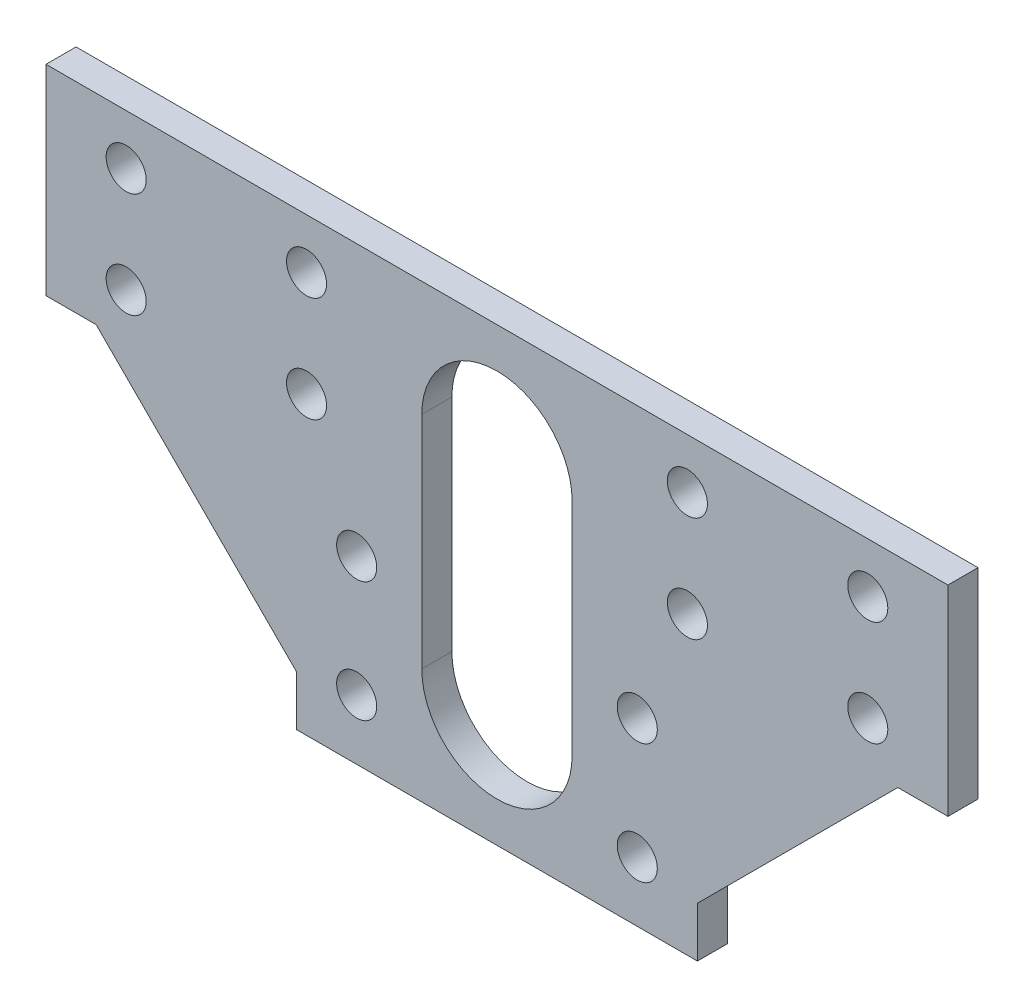
ISO-10303-21;
HEADER;
FILE_DESCRIPTION(('STEP AP214'),'2;1');
FILE_NAME('part.step','',(''),(''),'','','');
FILE_SCHEMA(('AUTOMOTIVE_DESIGN { 1 0 10303 214 1 1 1 1 }'));
ENDSEC;
DATA;
#1=APPLICATION_CONTEXT('core data for automotive mechanical design processes');
#2=APPLICATION_PROTOCOL_DEFINITION('international standard','automotive_design',2000,#1);
#3=PRODUCT_CONTEXT('',#1,'mechanical');
#4=PRODUCT('Part','Part','',(#3));
#5=PRODUCT_RELATED_PRODUCT_CATEGORY('part','',(#4));
#6=PRODUCT_DEFINITION_FORMATION('','',#4);
#7=PRODUCT_DEFINITION_CONTEXT('part definition',#1,'design');
#8=PRODUCT_DEFINITION('design','',#6,#7);
#9=PRODUCT_DEFINITION_SHAPE('','',#8);
#10=(LENGTH_UNIT() NAMED_UNIT(*) SI_UNIT(.MILLI.,.METRE.));
#11=(NAMED_UNIT(*) PLANE_ANGLE_UNIT() SI_UNIT($,.RADIAN.));
#12=(NAMED_UNIT(*) SI_UNIT($,.STERADIAN.) SOLID_ANGLE_UNIT());
#13=UNCERTAINTY_MEASURE_WITH_UNIT(LENGTH_MEASURE(1.E-05),#10,'distance_accuracy_value','');
#14=(GEOMETRIC_REPRESENTATION_CONTEXT(3) GLOBAL_UNCERTAINTY_ASSIGNED_CONTEXT((#13)) GLOBAL_UNIT_ASSIGNED_CONTEXT((#10,
#11,#12)) REPRESENTATION_CONTEXT('',''));
#15=CARTESIAN_POINT('',(0.,0.,0.));
#16=DIRECTION('',(0.,0.,1.));
#17=DIRECTION('',(1.,0.,0.));
#18=AXIS2_PLACEMENT_3D('',#15,#16,#17);
#19=CARTESIAN_POINT('',(0.,-20.,3.));
#20=DIRECTION('',(1.,0.,0.));
#21=DIRECTION('',(0.,0.,-1.));
#22=AXIS2_PLACEMENT_3D('',#19,#20,#21);
#23=PLANE('',#22);
#24=DIRECTION('',(0.,-1.,0.));
#25=VECTOR('',#24,1.);
#26=CARTESIAN_POINT('',(0.,-20.,0.));
#27=LINE('',#26,#25);
#28=CARTESIAN_POINT('',(0.,0.,0.));
#29=VERTEX_POINT('',#28);
#30=CARTESIAN_POINT('',(0.,-20.,0.));
#31=VERTEX_POINT('',#30);
#32=EDGE_CURVE('E239',#29,#31,#27,.T.);
#33=ORIENTED_EDGE('',*,*,#32,.T.);
#34=DIRECTION('',(0.,0.,-1.));
#35=VECTOR('',#34,1.);
#36=CARTESIAN_POINT('',(0.,-20.,3.));
#37=LINE('',#36,#35);
#38=CARTESIAN_POINT('',(0.,-20.,3.));
#39=VERTEX_POINT('',#38);
#40=EDGE_CURVE('E11',#39,#31,#37,.T.);
#41=ORIENTED_EDGE('',*,*,#40,.F.);
#42=DIRECTION('',(0.,-1.,0.));
#43=VECTOR('',#42,1.);
#44=CARTESIAN_POINT('',(0.,-20.,3.));
#45=LINE('',#44,#43);
#46=CARTESIAN_POINT('',(0.,0.,3.));
#47=VERTEX_POINT('',#46);
#48=EDGE_CURVE('E242',#47,#39,#45,.T.);
#49=ORIENTED_EDGE('',*,*,#48,.F.);
#50=DIRECTION('',(0.,0.,-1.));
#51=VECTOR('',#50,1.);
#52=CARTESIAN_POINT('',(0.,0.,3.));
#53=LINE('',#52,#51);
#54=EDGE_CURVE('E264',#47,#29,#53,.T.);
#55=ORIENTED_EDGE('',*,*,#54,.T.);
#56=EDGE_LOOP('',(#33,#41,#49,#55));
#57=FACE_BOUND('',#56,.T.);
#58=ADVANCED_FACE('F35',(#57),#23,.F.);
#59=CARTESIAN_POINT('',(5.,-20.,3.));
#60=DIRECTION('',(0.,1.,0.));
#61=DIRECTION('',(-1.,0.,0.));
#62=AXIS2_PLACEMENT_3D('',#59,#60,#61);
#63=PLANE('',#62);
#64=DIRECTION('',(1.,0.,0.));
#65=VECTOR('',#64,1.);
#66=CARTESIAN_POINT('',(5.,-20.,0.));
#67=LINE('',#66,#65);
#68=CARTESIAN_POINT('',(5.,-20.,0.));
#69=VERTEX_POINT('',#68);
#70=EDGE_CURVE('E267',#31,#69,#67,.T.);
#71=ORIENTED_EDGE('',*,*,#70,.T.);
#72=DIRECTION('',(0.,0.,-1.));
#73=VECTOR('',#72,1.);
#74=CARTESIAN_POINT('',(5.,-20.,3.));
#75=LINE('',#74,#73);
#76=CARTESIAN_POINT('',(5.,-20.,3.));
#77=VERTEX_POINT('',#76);
#78=EDGE_CURVE('E42',#77,#69,#75,.T.);
#79=ORIENTED_EDGE('',*,*,#78,.F.);
#80=DIRECTION('',(1.,0.,0.));
#81=VECTOR('',#80,1.);
#82=CARTESIAN_POINT('',(5.,-20.,3.));
#83=LINE('',#82,#81);
#84=EDGE_CURVE('E245',#39,#77,#83,.T.);
#85=ORIENTED_EDGE('',*,*,#84,.F.);
#86=ORIENTED_EDGE('',*,*,#40,.T.);
#87=EDGE_LOOP('',(#71,#79,#85,#86));
#88=FACE_BOUND('',#87,.T.);
#89=ADVANCED_FACE('F333',(#88),#63,.F.);
#90=CARTESIAN_POINT('',(25.,-39.9999999999998,3.));
#91=DIRECTION('',(0.707106781186543,0.707106781186552,0.));
#92=DIRECTION('',(-0.707106781186552,0.707106781186543,0.));
#93=AXIS2_PLACEMENT_3D('',#90,#91,#92);
#94=PLANE('',#93);
#95=DIRECTION('',(0.707106781186552,-0.707106781186543,0.));
#96=VECTOR('',#95,1.);
#97=CARTESIAN_POINT('',(25.,-39.9999999999998,0.));
#98=LINE('',#97,#96);
#99=CARTESIAN_POINT('',(25.,-39.9999999999998,0.));
#100=VERTEX_POINT('',#99);
#101=EDGE_CURVE('E269',#69,#100,#98,.T.);
#102=ORIENTED_EDGE('',*,*,#101,.T.);
#103=DIRECTION('',(0.,0.,-1.));
#104=VECTOR('',#103,1.);
#105=CARTESIAN_POINT('',(25.,-39.9999999999998,3.));
#106=LINE('',#105,#104);
#107=CARTESIAN_POINT('',(25.,-39.9999999999998,3.));
#108=VERTEX_POINT('',#107);
#109=EDGE_CURVE('E304',#108,#100,#106,.T.);
#110=ORIENTED_EDGE('',*,*,#109,.F.);
#111=DIRECTION('',(0.707106781186552,-0.707106781186543,0.));
#112=VECTOR('',#111,1.);
#113=CARTESIAN_POINT('',(25.,-39.9999999999998,3.));
#114=LINE('',#113,#112);
#115=EDGE_CURVE('E248',#77,#108,#114,.T.);
#116=ORIENTED_EDGE('',*,*,#115,.F.);
#117=ORIENTED_EDGE('',*,*,#78,.T.);
#118=EDGE_LOOP('',(#102,#110,#116,#117));
#119=FACE_BOUND('',#118,.T.);
#120=ADVANCED_FACE('F311',(#119),#94,.F.);
#121=CARTESIAN_POINT('',(25.,-45.,3.));
#122=DIRECTION('',(1.,0.,0.));
#123=DIRECTION('',(0.,0.,-1.));
#124=AXIS2_PLACEMENT_3D('',#121,#122,#123);
#125=PLANE('',#124);
#126=DIRECTION('',(0.,-1.,0.));
#127=VECTOR('',#126,1.);
#128=CARTESIAN_POINT('',(25.,-45.,0.));
#129=LINE('',#128,#127);
#130=CARTESIAN_POINT('',(25.,-45.,0.));
#131=VERTEX_POINT('',#130);
#132=EDGE_CURVE('E271',#100,#131,#129,.T.);
#133=ORIENTED_EDGE('',*,*,#132,.T.);
#134=DIRECTION('',(0.,0.,-1.));
#135=VECTOR('',#134,1.);
#136=CARTESIAN_POINT('',(25.,-45.,3.));
#137=LINE('',#136,#135);
#138=CARTESIAN_POINT('',(25.,-45.,3.));
#139=VERTEX_POINT('',#138);
#140=EDGE_CURVE('E301',#139,#131,#137,.T.);
#141=ORIENTED_EDGE('',*,*,#140,.F.);
#142=DIRECTION('',(0.,-1.,0.));
#143=VECTOR('',#142,1.);
#144=CARTESIAN_POINT('',(25.,-45.,3.));
#145=LINE('',#144,#143);
#146=EDGE_CURVE('E250',#108,#139,#145,.T.);
#147=ORIENTED_EDGE('',*,*,#146,.F.);
#148=ORIENTED_EDGE('',*,*,#109,.T.);
#149=EDGE_LOOP('',(#133,#141,#147,#148));
#150=FACE_BOUND('',#149,.T.);
#151=ADVANCED_FACE('F321',(#150),#125,.F.);
#152=CARTESIAN_POINT('',(65.,-45.,3.));
#153=DIRECTION('',(0.,1.,0.));
#154=DIRECTION('',(0.,0.,1.));
#155=AXIS2_PLACEMENT_3D('',#152,#153,#154);
#156=PLANE('',#155);
#157=DIRECTION('',(1.,0.,0.));
#158=VECTOR('',#157,1.);
#159=CARTESIAN_POINT('',(65.,-45.,0.));
#160=LINE('',#159,#158);
#161=CARTESIAN_POINT('',(65.,-45.,0.));
#162=VERTEX_POINT('',#161);
#163=EDGE_CURVE('E273',#131,#162,#160,.T.);
#164=ORIENTED_EDGE('',*,*,#163,.T.);
#165=DIRECTION('',(0.,0.,-1.));
#166=VECTOR('',#165,1.);
#167=CARTESIAN_POINT('',(65.,-45.,3.));
#168=LINE('',#167,#166);
#169=CARTESIAN_POINT('',(65.,-45.,3.));
#170=VERTEX_POINT('',#169);
#171=EDGE_CURVE('E298',#170,#162,#168,.T.);
#172=ORIENTED_EDGE('',*,*,#171,.F.);
#173=DIRECTION('',(1.,0.,0.));
#174=VECTOR('',#173,1.);
#175=CARTESIAN_POINT('',(65.,-45.,3.));
#176=LINE('',#175,#174);
#177=EDGE_CURVE('E252',#139,#170,#176,.T.);
#178=ORIENTED_EDGE('',*,*,#177,.F.);
#179=ORIENTED_EDGE('',*,*,#140,.T.);
#180=EDGE_LOOP('',(#164,#172,#178,#179));
#181=FACE_BOUND('',#180,.T.);
#182=ADVANCED_FACE('F325',(#181),#156,.F.);
#183=CARTESIAN_POINT('',(65.,-40.0000000000002,3.));
#184=DIRECTION('',(-1.,0.,0.));
#185=DIRECTION('',(0.,0.,1.));
#186=AXIS2_PLACEMENT_3D('',#183,#184,#185);
#187=PLANE('',#186);
#188=DIRECTION('',(0.,1.,0.));
#189=VECTOR('',#188,1.);
#190=CARTESIAN_POINT('',(65.,-40.0000000000002,0.));
#191=LINE('',#190,#189);
#192=CARTESIAN_POINT('',(65.,-40.0000000000002,0.));
#193=VERTEX_POINT('',#192);
#194=EDGE_CURVE('E275',#162,#193,#191,.T.);
#195=ORIENTED_EDGE('',*,*,#194,.T.);
#196=DIRECTION('',(0.,0.,-1.));
#197=VECTOR('',#196,1.);
#198=CARTESIAN_POINT('',(65.,-40.0000000000002,3.));
#199=LINE('',#198,#197);
#200=CARTESIAN_POINT('',(65.,-40.0000000000002,3.));
#201=VERTEX_POINT('',#200);
#202=EDGE_CURVE('E295',#201,#193,#199,.T.);
#203=ORIENTED_EDGE('',*,*,#202,.F.);
#204=DIRECTION('',(0.,1.,0.));
#205=VECTOR('',#204,1.);
#206=CARTESIAN_POINT('',(65.,-40.0000000000002,3.));
#207=LINE('',#206,#205);
#208=EDGE_CURVE('E254',#170,#201,#207,.T.);
#209=ORIENTED_EDGE('',*,*,#208,.F.);
#210=ORIENTED_EDGE('',*,*,#171,.T.);
#211=EDGE_LOOP('',(#195,#203,#209,#210));
#212=FACE_BOUND('',#211,.T.);
#213=ADVANCED_FACE('F356',(#212),#187,.F.);
#214=CARTESIAN_POINT('',(85.,-20.,3.));
#215=DIRECTION('',(-0.707106781186552,0.707106781186543,0.));
#216=DIRECTION('',(-0.707106781186543,-0.707106781186552,0.));
#217=AXIS2_PLACEMENT_3D('',#214,#215,#216);
#218=PLANE('',#217);
#219=DIRECTION('',(0.707106781186543,0.707106781186552,0.));
#220=VECTOR('',#219,1.);
#221=CARTESIAN_POINT('',(85.,-20.,0.));
#222=LINE('',#221,#220);
#223=CARTESIAN_POINT('',(85.,-20.,0.));
#224=VERTEX_POINT('',#223);
#225=EDGE_CURVE('E277',#193,#224,#222,.T.);
#226=ORIENTED_EDGE('',*,*,#225,.T.);
#227=DIRECTION('',(0.,0.,-1.));
#228=VECTOR('',#227,1.);
#229=CARTESIAN_POINT('',(85.,-20.,3.));
#230=LINE('',#229,#228);
#231=CARTESIAN_POINT('',(85.,-20.,3.));
#232=VERTEX_POINT('',#231);
#233=EDGE_CURVE('E292',#232,#224,#230,.T.);
#234=ORIENTED_EDGE('',*,*,#233,.F.);
#235=DIRECTION('',(0.707106781186543,0.707106781186552,0.));
#236=VECTOR('',#235,1.);
#237=CARTESIAN_POINT('',(85.,-20.,3.));
#238=LINE('',#237,#236);
#239=EDGE_CURVE('E256',#201,#232,#238,.T.);
#240=ORIENTED_EDGE('',*,*,#239,.F.);
#241=ORIENTED_EDGE('',*,*,#202,.T.);
#242=EDGE_LOOP('',(#226,#234,#240,#241));
#243=FACE_BOUND('',#242,.T.);
#244=ADVANCED_FACE('F353',(#243),#218,.F.);
#245=CARTESIAN_POINT('',(90.,-20.,3.));
#246=DIRECTION('',(0.,1.,0.));
#247=DIRECTION('',(0.,0.,1.));
#248=AXIS2_PLACEMENT_3D('',#245,#246,#247);
#249=PLANE('',#248);
#250=DIRECTION('',(1.,0.,0.));
#251=VECTOR('',#250,1.);
#252=CARTESIAN_POINT('',(90.,-20.,0.));
#253=LINE('',#252,#251);
#254=CARTESIAN_POINT('',(90.,-20.,0.));
#255=VERTEX_POINT('',#254);
#256=EDGE_CURVE('E279',#224,#255,#253,.T.);
#257=ORIENTED_EDGE('',*,*,#256,.T.);
#258=DIRECTION('',(0.,0.,-1.));
#259=VECTOR('',#258,1.);
#260=CARTESIAN_POINT('',(90.,-20.,3.));
#261=LINE('',#260,#259);
#262=CARTESIAN_POINT('',(90.,-20.,3.));
#263=VERTEX_POINT('',#262);
#264=EDGE_CURVE('E289',#263,#255,#261,.T.);
#265=ORIENTED_EDGE('',*,*,#264,.F.);
#266=DIRECTION('',(1.,0.,0.));
#267=VECTOR('',#266,1.);
#268=CARTESIAN_POINT('',(90.,-20.,3.));
#269=LINE('',#268,#267);
#270=EDGE_CURVE('E258',#232,#263,#269,.T.);
#271=ORIENTED_EDGE('',*,*,#270,.F.);
#272=ORIENTED_EDGE('',*,*,#233,.T.);
#273=EDGE_LOOP('',(#257,#265,#271,#272));
#274=FACE_BOUND('',#273,.T.);
#275=ADVANCED_FACE('F349',(#274),#249,.F.);
#276=CARTESIAN_POINT('',(90.,0.,3.));
#277=DIRECTION('',(-1.,0.,0.));
#278=DIRECTION('',(0.,0.,1.));
#279=AXIS2_PLACEMENT_3D('',#276,#277,#278);
#280=PLANE('',#279);
#281=DIRECTION('',(0.,1.,0.));
#282=VECTOR('',#281,1.);
#283=CARTESIAN_POINT('',(90.,0.,0.));
#284=LINE('',#283,#282);
#285=CARTESIAN_POINT('',(90.,0.,0.));
#286=VERTEX_POINT('',#285);
#287=EDGE_CURVE('E281',#255,#286,#284,.T.);
#288=ORIENTED_EDGE('',*,*,#287,.T.);
#289=DIRECTION('',(0.,0.,-1.));
#290=VECTOR('',#289,1.);
#291=CARTESIAN_POINT('',(90.,0.,3.));
#292=LINE('',#291,#290);
#293=CARTESIAN_POINT('',(90.,0.,3.));
#294=VERTEX_POINT('',#293);
#295=EDGE_CURVE('E286',#294,#286,#292,.T.);
#296=ORIENTED_EDGE('',*,*,#295,.F.);
#297=DIRECTION('',(0.,1.,0.));
#298=VECTOR('',#297,1.);
#299=CARTESIAN_POINT('',(90.,0.,3.));
#300=LINE('',#299,#298);
#301=EDGE_CURVE('E260',#263,#294,#300,.T.);
#302=ORIENTED_EDGE('',*,*,#301,.F.);
#303=ORIENTED_EDGE('',*,*,#264,.T.);
#304=EDGE_LOOP('',(#288,#296,#302,#303));
#305=FACE_BOUND('',#304,.T.);
#306=ADVANCED_FACE('F345',(#305),#280,.F.);
#307=CARTESIAN_POINT('',(0.,0.,3.));
#308=DIRECTION('',(0.,-1.,0.));
#309=DIRECTION('',(0.,0.,-1.));
#310=AXIS2_PLACEMENT_3D('',#307,#308,#309);
#311=PLANE('',#310);
#312=DIRECTION('',(-1.,0.,0.));
#313=VECTOR('',#312,1.);
#314=CARTESIAN_POINT('',(0.,0.,0.));
#315=LINE('',#314,#313);
#316=EDGE_CURVE('E246',#286,#29,#315,.T.);
#317=ORIENTED_EDGE('',*,*,#316,.T.);
#318=ORIENTED_EDGE('',*,*,#54,.F.);
#319=DIRECTION('',(-1.,0.,0.));
#320=VECTOR('',#319,1.);
#321=CARTESIAN_POINT('',(0.,0.,3.));
#322=LINE('',#321,#320);
#323=EDGE_CURVE('E262',#294,#47,#322,.T.);
#324=ORIENTED_EDGE('',*,*,#323,.F.);
#325=ORIENTED_EDGE('',*,*,#295,.T.);
#326=EDGE_LOOP('',(#317,#318,#324,#325));
#327=FACE_BOUND('',#326,.T.);
#328=ADVANCED_FACE('F340',(#327),#311,.F.);
#329=CARTESIAN_POINT('',(0.,0.,3.));
#330=DIRECTION('',(0.,0.,-1.));
#331=DIRECTION('',(-1.,0.,0.));
#332=AXIS2_PLACEMENT_3D('',#329,#330,#331);
#333=PLANE('',#332);
#334=CARTESIAN_POINT('',(26.,-15.5,3.));
#335=DIRECTION('',(0.,0.,1.));
#336=DIRECTION('',(1.,0.,0.));
#337=AXIS2_PLACEMENT_3D('',#334,#335,#336);
#338=CIRCLE('',#337,2.00000000000001);
#339=CARTESIAN_POINT('',(28.,-15.5,3.));
#340=VERTEX_POINT('',#339);
#341=EDGE_CURVE('E204',#340,#340,#338,.T.);
#342=ORIENTED_EDGE('',*,*,#341,.F.);
#343=EDGE_LOOP('',(#342));
#344=FACE_BOUND('',#343,.T.);
#345=CARTESIAN_POINT('',(8.,-5.00000000000001,3.));
#346=DIRECTION('',(0.,0.,1.));
#347=DIRECTION('',(1.,0.,0.));
#348=AXIS2_PLACEMENT_3D('',#345,#346,#347);
#349=CIRCLE('',#348,2.);
#350=CARTESIAN_POINT('',(10.,-5.00000000000001,3.));
#351=VERTEX_POINT('',#350);
#352=EDGE_CURVE('E191',#351,#351,#349,.T.);
#353=ORIENTED_EDGE('',*,*,#352,.F.);
#354=EDGE_LOOP('',(#353));
#355=FACE_BOUND('',#354,.T.);
#356=CARTESIAN_POINT('',(8.,-15.5,3.));
#357=DIRECTION('',(0.,0.,1.));
#358=DIRECTION('',(1.,0.,0.));
#359=AXIS2_PLACEMENT_3D('',#356,#357,#358);
#360=CIRCLE('',#359,2.);
#361=CARTESIAN_POINT('',(10.,-15.5,3.));
#362=VERTEX_POINT('',#361);
#363=EDGE_CURVE('E192',#362,#362,#360,.T.);
#364=ORIENTED_EDGE('',*,*,#363,.F.);
#365=EDGE_LOOP('',(#364));
#366=FACE_BOUND('',#365,.T.);
#367=CARTESIAN_POINT('',(31.,-27.,3.));
#368=DIRECTION('',(0.,0.,1.));
#369=DIRECTION('',(1.,0.,0.));
#370=AXIS2_PLACEMENT_3D('',#367,#368,#369);
#371=CIRCLE('',#370,2.00000000000001);
#372=CARTESIAN_POINT('',(33.,-27.,3.));
#373=VERTEX_POINT('',#372);
#374=EDGE_CURVE('E177',#373,#373,#371,.T.);
#375=ORIENTED_EDGE('',*,*,#374,.F.);
#376=EDGE_LOOP('',(#375));
#377=FACE_BOUND('',#376,.T.);
#378=CARTESIAN_POINT('',(26.,-5.00000000000001,3.));
#379=DIRECTION('',(0.,0.,1.));
#380=DIRECTION('',(1.,0.,0.));
#381=AXIS2_PLACEMENT_3D('',#378,#379,#380);
#382=CIRCLE('',#381,2.);
#383=CARTESIAN_POINT('',(28.,-5.00000000000001,3.));
#384=VERTEX_POINT('',#383);
#385=EDGE_CURVE('E203',#384,#384,#382,.T.);
#386=ORIENTED_EDGE('',*,*,#385,.F.);
#387=EDGE_LOOP('',(#386));
#388=FACE_BOUND('',#387,.T.);
#389=CARTESIAN_POINT('',(64.,-5.00000000000001,3.));
#390=DIRECTION('',(0.,0.,1.));
#391=DIRECTION('',(1.,0.,0.));
#392=AXIS2_PLACEMENT_3D('',#389,#390,#391);
#393=CIRCLE('',#392,1.99999999999998);
#394=CARTESIAN_POINT('',(66.,-5.00000000000001,3.));
#395=VERTEX_POINT('',#394);
#396=EDGE_CURVE('E228',#395,#395,#393,.T.);
#397=ORIENTED_EDGE('',*,*,#396,.F.);
#398=EDGE_LOOP('',(#397));
#399=FACE_BOUND('',#398,.T.);
#400=CARTESIAN_POINT('',(64.,-15.5,3.));
#401=DIRECTION('',(0.,0.,1.));
#402=DIRECTION('',(1.,0.,0.));
#403=AXIS2_PLACEMENT_3D('',#400,#401,#402);
#404=CIRCLE('',#403,2.);
#405=CARTESIAN_POINT('',(66.,-15.5,3.));
#406=VERTEX_POINT('',#405);
#407=EDGE_CURVE('E222',#406,#406,#404,.T.);
#408=ORIENTED_EDGE('',*,*,#407,.F.);
#409=EDGE_LOOP('',(#408));
#410=FACE_BOUND('',#409,.T.);
#411=CARTESIAN_POINT('',(82.,-15.5,3.));
#412=DIRECTION('',(0.,0.,1.));
#413=DIRECTION('',(1.,0.,0.));
#414=AXIS2_PLACEMENT_3D('',#411,#412,#413);
#415=CIRCLE('',#414,2.);
#416=CARTESIAN_POINT('',(84.,-15.5,3.));
#417=VERTEX_POINT('',#416);
#418=EDGE_CURVE('E216',#417,#417,#415,.T.);
#419=ORIENTED_EDGE('',*,*,#418,.F.);
#420=EDGE_LOOP('',(#419));
#421=FACE_BOUND('',#420,.T.);
#422=DIRECTION('',(0.,-1.,0.));
#423=VECTOR('',#422,1.);
#424=CARTESIAN_POINT('',(37.5,-11.5,3.));
#425=LINE('',#424,#423);
#426=CARTESIAN_POINT('',(37.5,-11.5,3.));
#427=VERTEX_POINT('',#426);
#428=CARTESIAN_POINT('',(37.5,-33.5,3.));
#429=VERTEX_POINT('',#428);
#430=EDGE_CURVE('E165',#427,#429,#425,.T.);
#431=ORIENTED_EDGE('',*,*,#430,.F.);
#432=CARTESIAN_POINT('',(45.,-11.5,3.));
#433=DIRECTION('',(0.,0.,1.));
#434=DIRECTION('',(1.,0.,0.));
#435=AXIS2_PLACEMENT_3D('',#432,#433,#434);
#436=CIRCLE('',#435,7.50000000000001);
#437=CARTESIAN_POINT('',(52.5,-11.5,3.));
#438=VERTEX_POINT('',#437);
#439=EDGE_CURVE('E49',#438,#427,#436,.T.);
#440=ORIENTED_EDGE('',*,*,#439,.F.);
#441=DIRECTION('',(0.,1.,0.));
#442=VECTOR('',#441,1.);
#443=CARTESIAN_POINT('',(52.5,-11.5,3.));
#444=LINE('',#443,#442);
#445=CARTESIAN_POINT('',(52.5,-33.5,3.));
#446=VERTEX_POINT('',#445);
#447=EDGE_CURVE('E153',#446,#438,#444,.T.);
#448=ORIENTED_EDGE('',*,*,#447,.F.);
#449=CARTESIAN_POINT('',(45.,-33.5,3.));
#450=DIRECTION('',(0.,0.,1.));
#451=DIRECTION('',(1.,0.,0.));
#452=AXIS2_PLACEMENT_3D('',#449,#450,#451);
#453=CIRCLE('',#452,7.49999999999999);
#454=EDGE_CURVE('E156',#429,#446,#453,.T.);
#455=ORIENTED_EDGE('',*,*,#454,.F.);
#456=EDGE_LOOP('',(#431,#440,#448,#455));
#457=FACE_BOUND('',#456,.T.);
#458=CARTESIAN_POINT('',(59.,-39.,3.));
#459=DIRECTION('',(0.,0.,1.));
#460=DIRECTION('',(1.,0.,0.));
#461=AXIS2_PLACEMENT_3D('',#458,#459,#460);
#462=CIRCLE('',#461,2.);
#463=CARTESIAN_POINT('',(61.,-39.,3.));
#464=VERTEX_POINT('',#463);
#465=EDGE_CURVE('E159',#464,#464,#462,.T.);
#466=ORIENTED_EDGE('',*,*,#465,.F.);
#467=EDGE_LOOP('',(#466));
#468=FACE_BOUND('',#467,.T.);
#469=CARTESIAN_POINT('',(59.,-27.,3.));
#470=DIRECTION('',(0.,0.,1.));
#471=DIRECTION('',(1.,0.,0.));
#472=AXIS2_PLACEMENT_3D('',#469,#470,#471);
#473=CIRCLE('',#472,2.);
#474=CARTESIAN_POINT('',(61.,-27.,3.));
#475=VERTEX_POINT('',#474);
#476=EDGE_CURVE('E184',#475,#475,#473,.T.);
#477=ORIENTED_EDGE('',*,*,#476,.F.);
#478=EDGE_LOOP('',(#477));
#479=FACE_BOUND('',#478,.T.);
#480=CARTESIAN_POINT('',(31.,-39.,3.));
#481=DIRECTION('',(0.,0.,1.));
#482=DIRECTION('',(1.,0.,0.));
#483=AXIS2_PLACEMENT_3D('',#480,#481,#482);
#484=CIRCLE('',#483,2.00000000000001);
#485=CARTESIAN_POINT('',(33.,-39.,3.));
#486=VERTEX_POINT('',#485);
#487=EDGE_CURVE('E178',#486,#486,#484,.T.);
#488=ORIENTED_EDGE('',*,*,#487,.F.);
#489=EDGE_LOOP('',(#488));
#490=FACE_BOUND('',#489,.T.);
#491=CARTESIAN_POINT('',(82.,-5.00000000000001,3.));
#492=DIRECTION('',(0.,0.,1.));
#493=DIRECTION('',(1.,0.,0.));
#494=AXIS2_PLACEMENT_3D('',#491,#492,#493);
#495=CIRCLE('',#494,2.);
#496=CARTESIAN_POINT('',(84.,-5.00000000000001,3.));
#497=VERTEX_POINT('',#496);
#498=EDGE_CURVE('E215',#497,#497,#495,.T.);
#499=ORIENTED_EDGE('',*,*,#498,.F.);
#500=EDGE_LOOP('',(#499));
#501=FACE_BOUND('',#500,.T.);
#502=ORIENTED_EDGE('',*,*,#48,.T.);
#503=ORIENTED_EDGE('',*,*,#84,.T.);
#504=ORIENTED_EDGE('',*,*,#115,.T.);
#505=ORIENTED_EDGE('',*,*,#146,.T.);
#506=ORIENTED_EDGE('',*,*,#177,.T.);
#507=ORIENTED_EDGE('',*,*,#208,.T.);
#508=ORIENTED_EDGE('',*,*,#239,.T.);
#509=ORIENTED_EDGE('',*,*,#270,.T.);
#510=ORIENTED_EDGE('',*,*,#301,.T.);
#511=ORIENTED_EDGE('',*,*,#323,.T.);
#512=EDGE_LOOP('',(#502,#503,#504,#505,#506,#507,#508,#509,#510,#511));
#513=FACE_BOUND('',#512,.T.);
#514=ADVANCED_FACE('F329',(#344,#355,#366,#377,#388,#399,#410,#421,#457,#468,#479,#490,#501,
#513),#333,.F.);
#515=CARTESIAN_POINT('',(0.,0.,0.));
#516=DIRECTION('',(0.,0.,-1.));
#517=DIRECTION('',(-1.,0.,0.));
#518=AXIS2_PLACEMENT_3D('',#515,#516,#517);
#519=PLANE('',#518);
#520=CARTESIAN_POINT('',(26.,-15.5,0.));
#521=DIRECTION('',(0.,0.,1.));
#522=DIRECTION('',(1.,0.,0.));
#523=AXIS2_PLACEMENT_3D('',#520,#521,#522);
#524=CIRCLE('',#523,2.00000000000001);
#525=CARTESIAN_POINT('',(28.,-15.5,0.));
#526=VERTEX_POINT('',#525);
#527=EDGE_CURVE('E200',#526,#526,#524,.T.);
#528=ORIENTED_EDGE('',*,*,#527,.T.);
#529=EDGE_LOOP('',(#528));
#530=FACE_BOUND('',#529,.T.);
#531=CARTESIAN_POINT('',(8.,-5.00000000000001,0.));
#532=DIRECTION('',(0.,0.,1.));
#533=DIRECTION('',(1.,0.,0.));
#534=AXIS2_PLACEMENT_3D('',#531,#532,#533);
#535=CIRCLE('',#534,2.);
#536=CARTESIAN_POINT('',(10.,-5.00000000000001,0.));
#537=VERTEX_POINT('',#536);
#538=EDGE_CURVE('E207',#537,#537,#535,.T.);
#539=ORIENTED_EDGE('',*,*,#538,.T.);
#540=EDGE_LOOP('',(#539));
#541=FACE_BOUND('',#540,.T.);
#542=CARTESIAN_POINT('',(8.,-15.5,0.));
#543=DIRECTION('',(0.,0.,1.));
#544=DIRECTION('',(1.,0.,0.));
#545=AXIS2_PLACEMENT_3D('',#542,#543,#544);
#546=CIRCLE('',#545,2.);
#547=CARTESIAN_POINT('',(10.,-15.5,0.));
#548=VERTEX_POINT('',#547);
#549=EDGE_CURVE('E188',#548,#548,#546,.T.);
#550=ORIENTED_EDGE('',*,*,#549,.T.);
#551=EDGE_LOOP('',(#550));
#552=FACE_BOUND('',#551,.T.);
#553=CARTESIAN_POINT('',(31.,-27.,0.));
#554=DIRECTION('',(0.,0.,1.));
#555=DIRECTION('',(1.,0.,0.));
#556=AXIS2_PLACEMENT_3D('',#553,#554,#555);
#557=CIRCLE('',#556,2.00000000000001);
#558=CARTESIAN_POINT('',(33.,-27.,0.));
#559=VERTEX_POINT('',#558);
#560=EDGE_CURVE('E195',#559,#559,#557,.T.);
#561=ORIENTED_EDGE('',*,*,#560,.T.);
#562=EDGE_LOOP('',(#561));
#563=FACE_BOUND('',#562,.T.);
#564=CARTESIAN_POINT('',(26.,-5.00000000000001,0.));
#565=DIRECTION('',(0.,0.,1.));
#566=DIRECTION('',(1.,0.,0.));
#567=AXIS2_PLACEMENT_3D('',#564,#565,#566);
#568=CIRCLE('',#567,2.);
#569=CARTESIAN_POINT('',(28.,-5.00000000000001,0.));
#570=VERTEX_POINT('',#569);
#571=EDGE_CURVE('E231',#570,#570,#568,.T.);
#572=ORIENTED_EDGE('',*,*,#571,.T.);
#573=EDGE_LOOP('',(#572));
#574=FACE_BOUND('',#573,.T.);
#575=CARTESIAN_POINT('',(64.,-5.00000000000001,0.));
#576=DIRECTION('',(0.,0.,1.));
#577=DIRECTION('',(1.,0.,0.));
#578=AXIS2_PLACEMENT_3D('',#575,#576,#577);
#579=CIRCLE('',#578,1.99999999999998);
#580=CARTESIAN_POINT('',(66.,-5.00000000000001,0.));
#581=VERTEX_POINT('',#580);
#582=EDGE_CURVE('E225',#581,#581,#579,.T.);
#583=ORIENTED_EDGE('',*,*,#582,.T.);
#584=EDGE_LOOP('',(#583));
#585=FACE_BOUND('',#584,.T.);
#586=CARTESIAN_POINT('',(64.,-15.5,0.));
#587=DIRECTION('',(0.,0.,1.));
#588=DIRECTION('',(1.,0.,0.));
#589=AXIS2_PLACEMENT_3D('',#586,#587,#588);
#590=CIRCLE('',#589,2.);
#591=CARTESIAN_POINT('',(66.,-15.5,0.));
#592=VERTEX_POINT('',#591);
#593=EDGE_CURVE('E219',#592,#592,#590,.T.);
#594=ORIENTED_EDGE('',*,*,#593,.T.);
#595=EDGE_LOOP('',(#594));
#596=FACE_BOUND('',#595,.T.);
#597=CARTESIAN_POINT('',(82.,-15.5,0.));
#598=DIRECTION('',(0.,0.,1.));
#599=DIRECTION('',(1.,0.,0.));
#600=AXIS2_PLACEMENT_3D('',#597,#598,#599);
#601=CIRCLE('',#600,2.);
#602=CARTESIAN_POINT('',(84.,-15.5,0.));
#603=VERTEX_POINT('',#602);
#604=EDGE_CURVE('E212',#603,#603,#601,.T.);
#605=ORIENTED_EDGE('',*,*,#604,.T.);
#606=EDGE_LOOP('',(#605));
#607=FACE_BOUND('',#606,.T.);
#608=CARTESIAN_POINT('',(45.,-11.5,0.));
#609=DIRECTION('',(0.,0.,1.));
#610=DIRECTION('',(1.,0.,0.));
#611=AXIS2_PLACEMENT_3D('',#608,#609,#610);
#612=CIRCLE('',#611,7.50000000000001);
#613=CARTESIAN_POINT('',(52.5,-11.5,0.));
#614=VERTEX_POINT('',#613);
#615=CARTESIAN_POINT('',(37.5,-11.5,0.));
#616=VERTEX_POINT('',#615);
#617=EDGE_CURVE('E137',#614,#616,#612,.T.);
#618=ORIENTED_EDGE('',*,*,#617,.T.);
#619=DIRECTION('',(0.,-1.,0.));
#620=VECTOR('',#619,1.);
#621=CARTESIAN_POINT('',(37.5,-11.5,0.));
#622=LINE('',#621,#620);
#623=CARTESIAN_POINT('',(37.5,-33.5,0.));
#624=VERTEX_POINT('',#623);
#625=EDGE_CURVE('E146',#616,#624,#622,.T.);
#626=ORIENTED_EDGE('',*,*,#625,.T.);
#627=CARTESIAN_POINT('',(45.,-33.5,0.));
#628=DIRECTION('',(0.,0.,1.));
#629=DIRECTION('',(1.,0.,0.));
#630=AXIS2_PLACEMENT_3D('',#627,#628,#629);
#631=CIRCLE('',#630,7.49999999999999);
#632=CARTESIAN_POINT('',(52.5,-33.5,0.));
#633=VERTEX_POINT('',#632);
#634=EDGE_CURVE('E57',#624,#633,#631,.T.);
#635=ORIENTED_EDGE('',*,*,#634,.T.);
#636=DIRECTION('',(0.,1.,0.));
#637=VECTOR('',#636,1.);
#638=CARTESIAN_POINT('',(52.5,-11.5,0.));
#639=LINE('',#638,#637);
#640=EDGE_CURVE('E143',#633,#614,#639,.T.);
#641=ORIENTED_EDGE('',*,*,#640,.T.);
#642=EDGE_LOOP('',(#618,#626,#635,#641));
#643=FACE_BOUND('',#642,.T.);
#644=CARTESIAN_POINT('',(59.,-39.,0.));
#645=DIRECTION('',(0.,0.,1.));
#646=DIRECTION('',(1.,0.,0.));
#647=AXIS2_PLACEMENT_3D('',#644,#645,#646);
#648=CIRCLE('',#647,2.);
#649=CARTESIAN_POINT('',(61.,-39.,0.));
#650=VERTEX_POINT('',#649);
#651=EDGE_CURVE('E187',#650,#650,#648,.T.);
#652=ORIENTED_EDGE('',*,*,#651,.T.);
#653=EDGE_LOOP('',(#652));
#654=FACE_BOUND('',#653,.T.);
#655=CARTESIAN_POINT('',(59.,-27.,0.));
#656=DIRECTION('',(0.,0.,1.));
#657=DIRECTION('',(1.,0.,0.));
#658=AXIS2_PLACEMENT_3D('',#655,#656,#657);
#659=CIRCLE('',#658,2.);
#660=CARTESIAN_POINT('',(61.,-27.,0.));
#661=VERTEX_POINT('',#660);
#662=EDGE_CURVE('E181',#661,#661,#659,.T.);
#663=ORIENTED_EDGE('',*,*,#662,.T.);
#664=EDGE_LOOP('',(#663));
#665=FACE_BOUND('',#664,.T.);
#666=CARTESIAN_POINT('',(31.,-39.,0.));
#667=DIRECTION('',(0.,0.,1.));
#668=DIRECTION('',(1.,0.,0.));
#669=AXIS2_PLACEMENT_3D('',#666,#667,#668);
#670=CIRCLE('',#669,2.00000000000001);
#671=CARTESIAN_POINT('',(33.,-39.,0.));
#672=VERTEX_POINT('',#671);
#673=EDGE_CURVE('E174',#672,#672,#670,.T.);
#674=ORIENTED_EDGE('',*,*,#673,.T.);
#675=EDGE_LOOP('',(#674));
#676=FACE_BOUND('',#675,.T.);
#677=CARTESIAN_POINT('',(82.,-5.00000000000001,0.));
#678=DIRECTION('',(0.,0.,1.));
#679=DIRECTION('',(1.,0.,0.));
#680=AXIS2_PLACEMENT_3D('',#677,#678,#679);
#681=CIRCLE('',#680,2.);
#682=CARTESIAN_POINT('',(84.,-5.00000000000001,0.));
#683=VERTEX_POINT('',#682);
#684=EDGE_CURVE('E236',#683,#683,#681,.T.);
#685=ORIENTED_EDGE('',*,*,#684,.T.);
#686=EDGE_LOOP('',(#685));
#687=FACE_BOUND('',#686,.T.);
#688=ORIENTED_EDGE('',*,*,#32,.F.);
#689=ORIENTED_EDGE('',*,*,#316,.F.);
#690=ORIENTED_EDGE('',*,*,#287,.F.);
#691=ORIENTED_EDGE('',*,*,#256,.F.);
#692=ORIENTED_EDGE('',*,*,#225,.F.);
#693=ORIENTED_EDGE('',*,*,#194,.F.);
#694=ORIENTED_EDGE('',*,*,#163,.F.);
#695=ORIENTED_EDGE('',*,*,#132,.F.);
#696=ORIENTED_EDGE('',*,*,#101,.F.);
#697=ORIENTED_EDGE('',*,*,#70,.F.);
#698=EDGE_LOOP('',(#688,#689,#690,#691,#692,#693,#694,#695,#696,#697));
#699=FACE_BOUND('',#698,.T.);
#700=ADVANCED_FACE('F150',(#530,#541,#552,#563,#574,#585,#596,#607,#643,#654,#665,#676,#687,
#699),#519,.T.);
#701=CARTESIAN_POINT('',(82.,-5.00000000000001,0.));
#702=DIRECTION('',(0.,0.,1.));
#703=DIRECTION('',(1.,0.,0.));
#704=AXIS2_PLACEMENT_3D('',#701,#702,#703);
#705=CYLINDRICAL_SURFACE('',#704,2.);
#706=ORIENTED_EDGE('',*,*,#684,.F.);
#707=EDGE_LOOP('',(#706));
#708=FACE_BOUND('',#707,.T.);
#709=ORIENTED_EDGE('',*,*,#498,.T.);
#710=EDGE_LOOP('',(#709));
#711=FACE_BOUND('',#710,.T.);
#712=ADVANCED_FACE('F435',(#708,#711),#705,.F.);
#713=CARTESIAN_POINT('',(31.,-39.,0.));
#714=DIRECTION('',(0.,0.,1.));
#715=DIRECTION('',(1.,0.,0.));
#716=AXIS2_PLACEMENT_3D('',#713,#714,#715);
#717=CYLINDRICAL_SURFACE('',#716,2.00000000000001);
#718=ORIENTED_EDGE('',*,*,#673,.F.);
#719=EDGE_LOOP('',(#718));
#720=FACE_BOUND('',#719,.T.);
#721=ORIENTED_EDGE('',*,*,#487,.T.);
#722=EDGE_LOOP('',(#721));
#723=FACE_BOUND('',#722,.T.);
#724=ADVANCED_FACE('F445',(#720,#723),#717,.F.);
#725=CARTESIAN_POINT('',(59.,-27.,0.));
#726=DIRECTION('',(0.,0.,1.));
#727=DIRECTION('',(1.,0.,0.));
#728=AXIS2_PLACEMENT_3D('',#725,#726,#727);
#729=CYLINDRICAL_SURFACE('',#728,2.);
#730=ORIENTED_EDGE('',*,*,#662,.F.);
#731=EDGE_LOOP('',(#730));
#732=FACE_BOUND('',#731,.T.);
#733=ORIENTED_EDGE('',*,*,#476,.T.);
#734=EDGE_LOOP('',(#733));
#735=FACE_BOUND('',#734,.T.);
#736=ADVANCED_FACE('F455',(#732,#735),#729,.F.);
#737=CARTESIAN_POINT('',(59.,-39.,0.));
#738=DIRECTION('',(0.,0.,1.));
#739=DIRECTION('',(1.,0.,0.));
#740=AXIS2_PLACEMENT_3D('',#737,#738,#739);
#741=CYLINDRICAL_SURFACE('',#740,2.);
#742=ORIENTED_EDGE('',*,*,#651,.F.);
#743=EDGE_LOOP('',(#742));
#744=FACE_BOUND('',#743,.T.);
#745=ORIENTED_EDGE('',*,*,#465,.T.);
#746=EDGE_LOOP('',(#745));
#747=FACE_BOUND('',#746,.T.);
#748=ADVANCED_FACE('F465',(#744,#747),#741,.F.);
#749=CARTESIAN_POINT('',(45.,-11.5,0.));
#750=DIRECTION('',(0.,0.,1.));
#751=DIRECTION('',(1.,0.,0.));
#752=AXIS2_PLACEMENT_3D('',#749,#750,#751);
#753=CYLINDRICAL_SURFACE('',#752,7.50000000000001);
#754=ORIENTED_EDGE('',*,*,#439,.T.);
#755=DIRECTION('',(0.,0.,1.));
#756=VECTOR('',#755,1.);
#757=CARTESIAN_POINT('',(37.5,-11.5,0.));
#758=LINE('',#757,#756);
#759=EDGE_CURVE('E133',#616,#427,#758,.T.);
#760=ORIENTED_EDGE('',*,*,#759,.F.);
#761=ORIENTED_EDGE('',*,*,#617,.F.);
#762=DIRECTION('',(0.,0.,1.));
#763=VECTOR('',#762,1.);
#764=CARTESIAN_POINT('',(52.5,-11.5,0.));
#765=LINE('',#764,#763);
#766=EDGE_CURVE('E169',#614,#438,#765,.T.);
#767=ORIENTED_EDGE('',*,*,#766,.T.);
#768=EDGE_LOOP('',(#754,#760,#761,#767));
#769=FACE_BOUND('',#768,.T.);
#770=ADVANCED_FACE('F135',(#769),#753,.F.);
#771=CARTESIAN_POINT('',(52.5,-11.5,0.));
#772=DIRECTION('',(1.,0.,0.));
#773=DIRECTION('',(0.,1.,0.));
#774=AXIS2_PLACEMENT_3D('',#771,#772,#773);
#775=PLANE('',#774);
#776=ORIENTED_EDGE('',*,*,#447,.T.);
#777=ORIENTED_EDGE('',*,*,#766,.F.);
#778=ORIENTED_EDGE('',*,*,#640,.F.);
#779=DIRECTION('',(0.,0.,1.));
#780=VECTOR('',#779,1.);
#781=CARTESIAN_POINT('',(52.5,-33.5,0.));
#782=LINE('',#781,#780);
#783=EDGE_CURVE('E171',#633,#446,#782,.T.);
#784=ORIENTED_EDGE('',*,*,#783,.T.);
#785=EDGE_LOOP('',(#776,#777,#778,#784));
#786=FACE_BOUND('',#785,.T.);
#787=ADVANCED_FACE('F484',(#786),#775,.F.);
#788=CARTESIAN_POINT('',(45.,-33.5,0.));
#789=DIRECTION('',(0.,0.,1.));
#790=DIRECTION('',(1.,0.,0.));
#791=AXIS2_PLACEMENT_3D('',#788,#789,#790);
#792=CYLINDRICAL_SURFACE('',#791,7.49999999999999);
#793=ORIENTED_EDGE('',*,*,#454,.T.);
#794=ORIENTED_EDGE('',*,*,#783,.F.);
#795=ORIENTED_EDGE('',*,*,#634,.F.);
#796=DIRECTION('',(0.,0.,1.));
#797=VECTOR('',#796,1.);
#798=CARTESIAN_POINT('',(37.5,-33.5,0.));
#799=LINE('',#798,#797);
#800=EDGE_CURVE('E142',#624,#429,#799,.T.);
#801=ORIENTED_EDGE('',*,*,#800,.T.);
#802=EDGE_LOOP('',(#793,#794,#795,#801));
#803=FACE_BOUND('',#802,.T.);
#804=ADVANCED_FACE('F493',(#803),#792,.F.);
#805=CARTESIAN_POINT('',(37.5,-11.5,0.));
#806=DIRECTION('',(-1.,0.,0.));
#807=DIRECTION('',(0.,-1.,0.));
#808=AXIS2_PLACEMENT_3D('',#805,#806,#807);
#809=PLANE('',#808);
#810=ORIENTED_EDGE('',*,*,#430,.T.);
#811=ORIENTED_EDGE('',*,*,#800,.F.);
#812=ORIENTED_EDGE('',*,*,#625,.F.);
#813=ORIENTED_EDGE('',*,*,#759,.T.);
#814=EDGE_LOOP('',(#810,#811,#812,#813));
#815=FACE_BOUND('',#814,.T.);
#816=ADVANCED_FACE('F147',(#815),#809,.F.);
#817=CARTESIAN_POINT('',(82.,-15.5,0.));
#818=DIRECTION('',(0.,0.,1.));
#819=DIRECTION('',(1.,0.,0.));
#820=AXIS2_PLACEMENT_3D('',#817,#818,#819);
#821=CYLINDRICAL_SURFACE('',#820,2.);
#822=ORIENTED_EDGE('',*,*,#604,.F.);
#823=EDGE_LOOP('',(#822));
#824=FACE_BOUND('',#823,.T.);
#825=ORIENTED_EDGE('',*,*,#418,.T.);
#826=EDGE_LOOP('',(#825));
#827=FACE_BOUND('',#826,.T.);
#828=ADVANCED_FACE('F511',(#824,#827),#821,.F.);
#829=CARTESIAN_POINT('',(64.,-15.5,0.));
#830=DIRECTION('',(0.,0.,1.));
#831=DIRECTION('',(1.,0.,0.));
#832=AXIS2_PLACEMENT_3D('',#829,#830,#831);
#833=CYLINDRICAL_SURFACE('',#832,2.);
#834=ORIENTED_EDGE('',*,*,#593,.F.);
#835=EDGE_LOOP('',(#834));
#836=FACE_BOUND('',#835,.T.);
#837=ORIENTED_EDGE('',*,*,#407,.T.);
#838=EDGE_LOOP('',(#837));
#839=FACE_BOUND('',#838,.T.);
#840=ADVANCED_FACE('F520',(#836,#839),#833,.F.);
#841=CARTESIAN_POINT('',(64.,-5.00000000000001,0.));
#842=DIRECTION('',(0.,0.,1.));
#843=DIRECTION('',(1.,0.,0.));
#844=AXIS2_PLACEMENT_3D('',#841,#842,#843);
#845=CYLINDRICAL_SURFACE('',#844,1.99999999999998);
#846=ORIENTED_EDGE('',*,*,#582,.F.);
#847=EDGE_LOOP('',(#846));
#848=FACE_BOUND('',#847,.T.);
#849=ORIENTED_EDGE('',*,*,#396,.T.);
#850=EDGE_LOOP('',(#849));
#851=FACE_BOUND('',#850,.T.);
#852=ADVANCED_FACE('F530',(#848,#851),#845,.F.);
#853=CARTESIAN_POINT('',(26.,-5.00000000000001,0.));
#854=DIRECTION('',(0.,0.,1.));
#855=DIRECTION('',(1.,0.,0.));
#856=AXIS2_PLACEMENT_3D('',#853,#854,#855);
#857=CYLINDRICAL_SURFACE('',#856,2.);
#858=ORIENTED_EDGE('',*,*,#571,.F.);
#859=EDGE_LOOP('',(#858));
#860=FACE_BOUND('',#859,.T.);
#861=ORIENTED_EDGE('',*,*,#385,.T.);
#862=EDGE_LOOP('',(#861));
#863=FACE_BOUND('',#862,.T.);
#864=ADVANCED_FACE('F540',(#860,#863),#857,.F.);
#865=CARTESIAN_POINT('',(31.,-27.,0.));
#866=DIRECTION('',(0.,0.,1.));
#867=DIRECTION('',(1.,0.,0.));
#868=AXIS2_PLACEMENT_3D('',#865,#866,#867);
#869=CYLINDRICAL_SURFACE('',#868,2.00000000000001);
#870=ORIENTED_EDGE('',*,*,#560,.F.);
#871=EDGE_LOOP('',(#870));
#872=FACE_BOUND('',#871,.T.);
#873=ORIENTED_EDGE('',*,*,#374,.T.);
#874=EDGE_LOOP('',(#873));
#875=FACE_BOUND('',#874,.T.);
#876=ADVANCED_FACE('F550',(#872,#875),#869,.F.);
#877=CARTESIAN_POINT('',(8.,-15.5,0.));
#878=DIRECTION('',(0.,0.,1.));
#879=DIRECTION('',(1.,0.,0.));
#880=AXIS2_PLACEMENT_3D('',#877,#878,#879);
#881=CYLINDRICAL_SURFACE('',#880,2.);
#882=ORIENTED_EDGE('',*,*,#549,.F.);
#883=EDGE_LOOP('',(#882));
#884=FACE_BOUND('',#883,.T.);
#885=ORIENTED_EDGE('',*,*,#363,.T.);
#886=EDGE_LOOP('',(#885));
#887=FACE_BOUND('',#886,.T.);
#888=ADVANCED_FACE('F560',(#884,#887),#881,.F.);
#889=CARTESIAN_POINT('',(8.,-5.00000000000001,0.));
#890=DIRECTION('',(0.,0.,1.));
#891=DIRECTION('',(1.,0.,0.));
#892=AXIS2_PLACEMENT_3D('',#889,#890,#891);
#893=CYLINDRICAL_SURFACE('',#892,2.);
#894=ORIENTED_EDGE('',*,*,#538,.F.);
#895=EDGE_LOOP('',(#894));
#896=FACE_BOUND('',#895,.T.);
#897=ORIENTED_EDGE('',*,*,#352,.T.);
#898=EDGE_LOOP('',(#897));
#899=FACE_BOUND('',#898,.T.);
#900=ADVANCED_FACE('F570',(#896,#899),#893,.F.);
#901=CARTESIAN_POINT('',(26.,-15.5,0.));
#902=DIRECTION('',(0.,0.,1.));
#903=DIRECTION('',(1.,0.,0.));
#904=AXIS2_PLACEMENT_3D('',#901,#902,#903);
#905=CYLINDRICAL_SURFACE('',#904,2.00000000000001);
#906=ORIENTED_EDGE('',*,*,#527,.F.);
#907=EDGE_LOOP('',(#906));
#908=FACE_BOUND('',#907,.T.);
#909=ORIENTED_EDGE('',*,*,#341,.T.);
#910=EDGE_LOOP('',(#909));
#911=FACE_BOUND('',#910,.T.);
#912=ADVANCED_FACE('F580',(#908,#911),#905,.F.);
#913=CLOSED_SHELL('',(#58,#89,#120,#151,#182,#213,#244,#275,#306,#328,#514,#700,#712,#724,#736,
#748,#770,#787,#804,#816,#828,#840,#852,#864,#876,#888,#900,#912));
#914=MANIFOLD_SOLID_BREP('B2',#913);
#915=ADVANCED_BREP_SHAPE_REPRESENTATION('',(#18,#914),#14);
#916=SHAPE_DEFINITION_REPRESENTATION(#9,#915);
ENDSEC;
END-ISO-10303-21;
